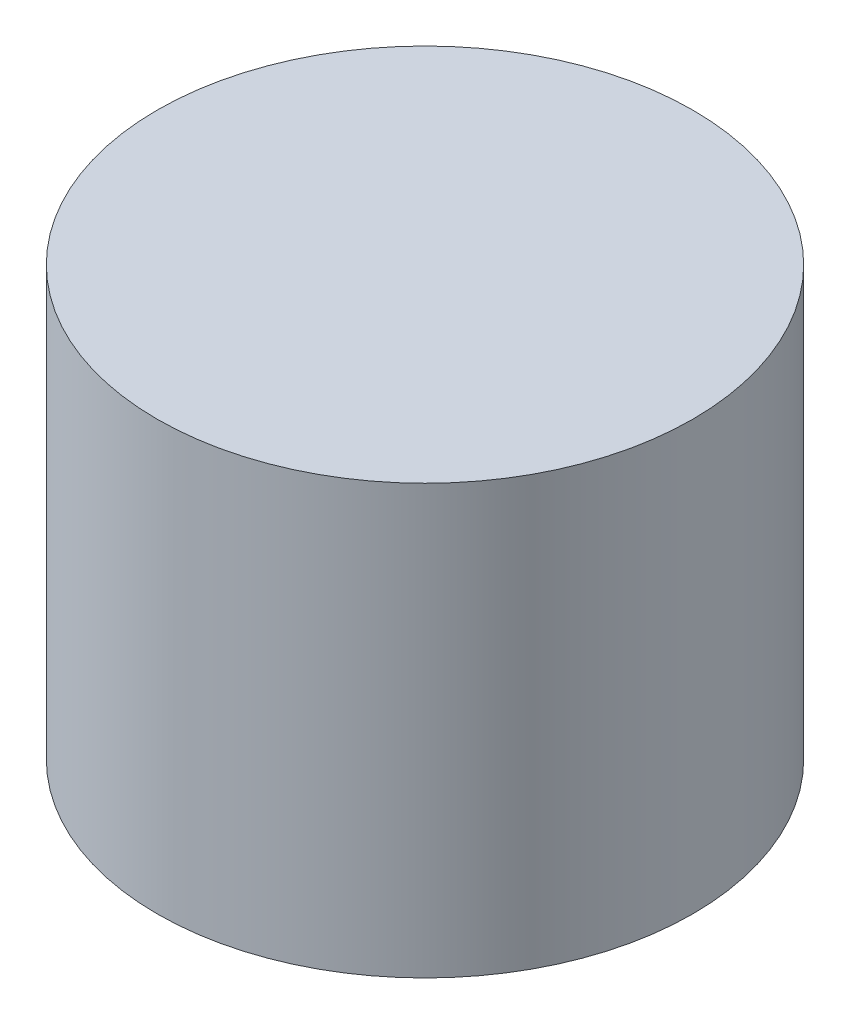
ISO-10303-21;
HEADER;
FILE_DESCRIPTION(('STEP AP214'),'2;1');
FILE_NAME('part.step','',(''),(''),'','','');
FILE_SCHEMA(('AUTOMOTIVE_DESIGN { 1 0 10303 214 1 1 1 1 }'));
ENDSEC;
DATA;
#1=APPLICATION_CONTEXT('core data for automotive mechanical design processes');
#2=APPLICATION_PROTOCOL_DEFINITION('international standard','automotive_design',2000,#1);
#3=PRODUCT_CONTEXT('',#1,'mechanical');
#4=PRODUCT('Part','Part','',(#3));
#5=PRODUCT_RELATED_PRODUCT_CATEGORY('part','',(#4));
#6=PRODUCT_DEFINITION_FORMATION('','',#4);
#7=PRODUCT_DEFINITION_CONTEXT('part definition',#1,'design');
#8=PRODUCT_DEFINITION('design','',#6,#7);
#9=PRODUCT_DEFINITION_SHAPE('','',#8);
#10=(LENGTH_UNIT() NAMED_UNIT(*) SI_UNIT(.MILLI.,.METRE.));
#11=(NAMED_UNIT(*) PLANE_ANGLE_UNIT() SI_UNIT($,.RADIAN.));
#12=(NAMED_UNIT(*) SI_UNIT($,.STERADIAN.) SOLID_ANGLE_UNIT());
#13=UNCERTAINTY_MEASURE_WITH_UNIT(LENGTH_MEASURE(1.E-05),#10,'distance_accuracy_value','');
#14=(GEOMETRIC_REPRESENTATION_CONTEXT(3) GLOBAL_UNCERTAINTY_ASSIGNED_CONTEXT((#13)) GLOBAL_UNIT_ASSIGNED_CONTEXT((#10,
#11,#12)) REPRESENTATION_CONTEXT('',''));
#15=CARTESIAN_POINT('',(0.,0.,0.));
#16=DIRECTION('',(0.,0.,1.));
#17=DIRECTION('',(1.,0.,0.));
#18=AXIS2_PLACEMENT_3D('',#15,#16,#17);
#19=CARTESIAN_POINT('',(0.,10.,0.));
#20=DIRECTION('',(0.,-1.,0.));
#21=DIRECTION('',(0.,0.,-1.));
#22=AXIS2_PLACEMENT_3D('',#19,#20,#21);
#23=CYLINDRICAL_SURFACE('',#22,6.25);
#24=CARTESIAN_POINT('',(0.,10.,0.));
#25=DIRECTION('',(0.,1.,0.));
#26=DIRECTION('',(0.,0.,1.));
#27=AXIS2_PLACEMENT_3D('',#24,#25,#26);
#28=CIRCLE('',#27,6.25);
#29=CARTESIAN_POINT('',(0.,10.,6.25));
#30=VERTEX_POINT('',#29);
#31=EDGE_CURVE('E10',#30,#30,#28,.T.);
#32=ORIENTED_EDGE('',*,*,#31,.F.);
#33=EDGE_LOOP('',(#32));
#34=FACE_BOUND('',#33,.T.);
#35=CARTESIAN_POINT('',(0.,0.,0.));
#36=DIRECTION('',(0.,1.,0.));
#37=DIRECTION('',(0.,0.,1.));
#38=AXIS2_PLACEMENT_3D('',#35,#36,#37);
#39=CIRCLE('',#38,6.25);
#40=CARTESIAN_POINT('',(0.,0.,6.25));
#41=VERTEX_POINT('',#40);
#42=EDGE_CURVE('E38',#41,#41,#39,.T.);
#43=ORIENTED_EDGE('',*,*,#42,.T.);
#44=EDGE_LOOP('',(#43));
#45=FACE_BOUND('',#44,.T.);
#46=ADVANCED_FACE('F35',(#34,#45),#23,.T.);
#47=CARTESIAN_POINT('',(0.,10.,0.));
#48=DIRECTION('',(0.,1.,0.));
#49=DIRECTION('',(0.,0.,1.));
#50=AXIS2_PLACEMENT_3D('',#47,#48,#49);
#51=PLANE('',#50);
#52=ORIENTED_EDGE('',*,*,#31,.T.);
#53=EDGE_LOOP('',(#52));
#54=FACE_BOUND('',#53,.T.);
#55=ADVANCED_FACE('F50',(#54),#51,.T.);
#56=CARTESIAN_POINT('',(0.,0.,0.));
#57=DIRECTION('',(0.,1.,0.));
#58=DIRECTION('',(0.,0.,1.));
#59=AXIS2_PLACEMENT_3D('',#56,#57,#58);
#60=PLANE('',#59);
#61=ORIENTED_EDGE('',*,*,#42,.F.);
#62=EDGE_LOOP('',(#61));
#63=FACE_BOUND('',#62,.T.);
#64=ADVANCED_FACE('F48',(#63),#60,.F.);
#65=CLOSED_SHELL('',(#46,#55,#64));
#66=MANIFOLD_SOLID_BREP('B2',#65);
#67=ADVANCED_BREP_SHAPE_REPRESENTATION('',(#18,#66),#14);
#68=SHAPE_DEFINITION_REPRESENTATION(#9,#67);
ENDSEC;
END-ISO-10303-21;
